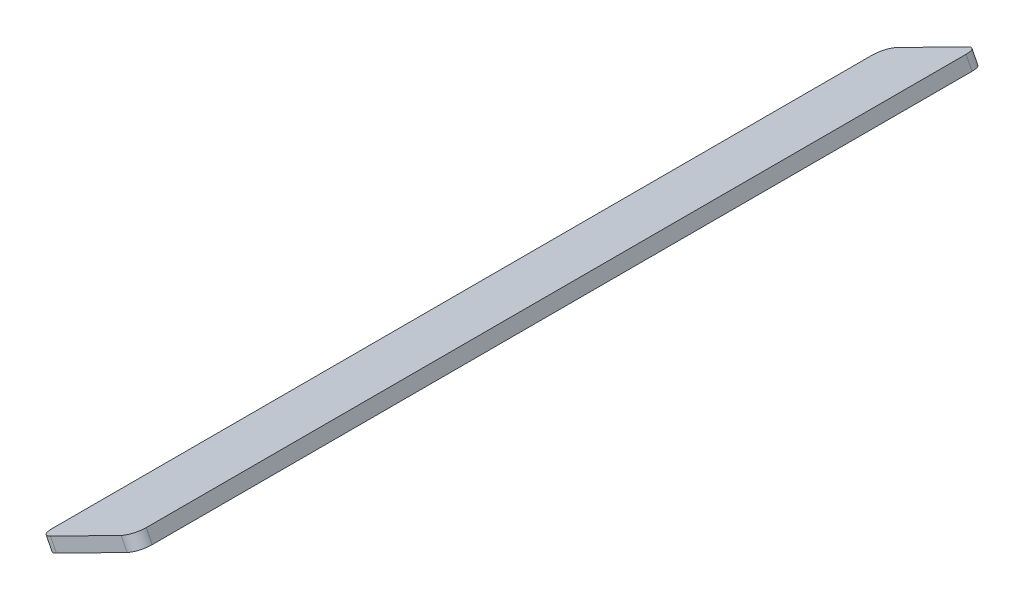
ISO-10303-21;
HEADER;
FILE_DESCRIPTION(('STEP AP214'),'2;1');
FILE_NAME('part.step','',(''),(''),'','','');
FILE_SCHEMA(('AUTOMOTIVE_DESIGN { 1 0 10303 214 1 1 1 1 }'));
ENDSEC;
DATA;
#1=APPLICATION_CONTEXT('core data for automotive mechanical design processes');
#2=APPLICATION_PROTOCOL_DEFINITION('international standard','automotive_design',2000,#1);
#3=PRODUCT_CONTEXT('',#1,'mechanical');
#4=PRODUCT('Part','Part','',(#3));
#5=PRODUCT_RELATED_PRODUCT_CATEGORY('part','',(#4));
#6=PRODUCT_DEFINITION_FORMATION('','',#4);
#7=PRODUCT_DEFINITION_CONTEXT('part definition',#1,'design');
#8=PRODUCT_DEFINITION('design','',#6,#7);
#9=PRODUCT_DEFINITION_SHAPE('','',#8);
#10=(LENGTH_UNIT() NAMED_UNIT(*) SI_UNIT(.MILLI.,.METRE.));
#11=(NAMED_UNIT(*) PLANE_ANGLE_UNIT() SI_UNIT($,.RADIAN.));
#12=(NAMED_UNIT(*) SI_UNIT($,.STERADIAN.) SOLID_ANGLE_UNIT());
#13=UNCERTAINTY_MEASURE_WITH_UNIT(LENGTH_MEASURE(1.E-05),#10,'distance_accuracy_value','');
#14=(GEOMETRIC_REPRESENTATION_CONTEXT(3) GLOBAL_UNCERTAINTY_ASSIGNED_CONTEXT((#13)) GLOBAL_UNIT_ASSIGNED_CONTEXT((#10,
#11,#12)) REPRESENTATION_CONTEXT('',''));
#15=CARTESIAN_POINT('',(0.,0.,0.));
#16=DIRECTION('',(0.,0.,1.));
#17=DIRECTION('',(1.,0.,0.));
#18=AXIS2_PLACEMENT_3D('',#15,#16,#17);
#19=CARTESIAN_POINT('',(449.468318070753,229.015546798506,-203.199999999995));
#20=DIRECTION('',(0.,0.,1.));
#21=DIRECTION('',(0.,-1.,0.));
#22=AXIS2_PLACEMENT_3D('',#19,#20,#21);
#23=PLANE('',#22);
#24=DIRECTION('',(0.891006524188365,0.453990499739552,0.));
#25=VECTOR('',#24,1.);
#26=CARTESIAN_POINT('',(250.436440102014,619.637601430368,-203.199999999999));
#27=LINE('',#26,#25);
#28=CARTESIAN_POINT('',(256.09433153061,622.520441103714,-203.199999999999));
#29=VERTEX_POINT('',#28);
#30=CARTESIAN_POINT('',(290.041680102187,639.817479143791,-203.199999999999));
#31=VERTEX_POINT('',#30);
#32=EDGE_CURVE('E134',#29,#31,#27,.T.);
#33=ORIENTED_EDGE('',*,*,#32,.T.);
#34=DIRECTION('',(0.453990499739552,-0.891006524188366,0.));
#35=VECTOR('',#34,1.);
#36=CARTESIAN_POINT('',(292.924519775532,634.159587715195,-203.199999999999));
#37=LINE('',#36,#35);
#38=CARTESIAN_POINT('',(292.924519775533,634.159587715195,-203.199999999999));
#39=VERTEX_POINT('',#38);
#40=EDGE_CURVE('E124',#31,#39,#37,.T.);
#41=ORIENTED_EDGE('',*,*,#40,.T.);
#42=DIRECTION('',(0.891006524188365,0.453990499739552,0.));
#43=VECTOR('',#42,1.);
#44=CARTESIAN_POINT('',(253.31927977536,613.979710001772,-203.199999999999));
#45=LINE('',#44,#43);
#46=CARTESIAN_POINT('',(258.977171203956,616.862549675118,-203.199999999999));
#47=VERTEX_POINT('',#46);
#48=EDGE_CURVE('E108',#47,#39,#45,.T.);
#49=ORIENTED_EDGE('',*,*,#48,.F.);
#50=DIRECTION('',(0.453990499739552,-0.891006524188366,0.));
#51=VECTOR('',#50,1.);
#52=CARTESIAN_POINT('',(455.126209499349,231.898386471852,-203.199999999995));
#53=LINE('',#52,#51);
#54=EDGE_CURVE('E121',#47,#29,#53,.F.);
#55=ORIENTED_EDGE('',*,*,#54,.T.);
#56=EDGE_LOOP('',(#33,#41,#49,#55));
#57=FACE_BOUND('',#56,.T.);
#58=ADVANCED_FACE('F39',(#57),#23,.F.);
#59=CARTESIAN_POINT('',(253.31927977536,613.979710001772,0.));
#60=DIRECTION('',(0.453990499739552,-0.891006524188365,0.));
#61=DIRECTION('',(0.891006524188365,0.453990499739552,0.));
#62=AXIS2_PLACEMENT_3D('',#59,#60,#61);
#63=PLANE('',#62);
#64=ORIENTED_EDGE('',*,*,#48,.T.);
#65=CARTESIAN_POINT('',(292.924519775533,634.159587715195,-196.849999999999));
#66=DIRECTION('',(0.453990499739552,-0.891006524188365,0.));
#67=DIRECTION('',(0.891006524188365,0.453990499739552,0.));
#68=AXIS2_PLACEMENT_3D('',#65,#66,#67);
#69=CIRCLE('',#68,6.35);
#70=CARTESIAN_POINT('',(298.582411204129,637.042427388541,-196.849999999999));
#71=VERTEX_POINT('',#70);
#72=EDGE_CURVE('E115',#39,#71,#69,.T.);
#73=ORIENTED_EDGE('',*,*,#72,.T.);
#74=DIRECTION('',(0.,0.,-1.));
#75=VECTOR('',#74,1.);
#76=CARTESIAN_POINT('',(298.582411204129,637.042427388541,0.));
#77=LINE('',#76,#75);
#78=CARTESIAN_POINT('',(298.582411204129,637.042427388541,196.85));
#79=VERTEX_POINT('',#78);
#80=EDGE_CURVE('E159',#79,#71,#77,.T.);
#81=ORIENTED_EDGE('',*,*,#80,.F.);
#82=CARTESIAN_POINT('',(292.924519775533,634.159587715195,196.85));
#83=DIRECTION('',(0.453990499739552,-0.891006524188365,0.));
#84=DIRECTION('',(0.891006524188365,0.453990499739552,0.));
#85=AXIS2_PLACEMENT_3D('',#82,#83,#84);
#86=CIRCLE('',#85,6.35);
#87=CARTESIAN_POINT('',(292.924519775533,634.159587715195,203.2));
#88=VERTEX_POINT('',#87);
#89=EDGE_CURVE('E131',#79,#88,#86,.T.);
#90=ORIENTED_EDGE('',*,*,#89,.T.);
#91=DIRECTION('',(0.891006524188365,0.453990499739552,0.));
#92=VECTOR('',#91,1.);
#93=CARTESIAN_POINT('',(253.31927977536,613.979710001772,203.2));
#94=LINE('',#93,#92);
#95=CARTESIAN_POINT('',(258.977171203956,616.862549675118,203.2));
#96=VERTEX_POINT('',#95);
#97=EDGE_CURVE('E125',#96,#88,#94,.T.);
#98=ORIENTED_EDGE('',*,*,#97,.F.);
#99=CARTESIAN_POINT('',(258.977171203956,616.862549675118,196.85));
#100=DIRECTION('',(0.453990499739552,-0.891006524188365,0.));
#101=DIRECTION('',(0.891006524188365,0.453990499739552,0.));
#102=AXIS2_PLACEMENT_3D('',#99,#100,#101);
#103=CIRCLE('',#102,6.35);
#104=CARTESIAN_POINT('',(253.31927977536,613.979710001772,196.85));
#105=VERTEX_POINT('',#104);
#106=EDGE_CURVE('E116',#96,#105,#103,.T.);
#107=ORIENTED_EDGE('',*,*,#106,.T.);
#108=DIRECTION('',(0.,0.,-1.));
#109=VECTOR('',#108,1.);
#110=CARTESIAN_POINT('',(253.31927977536,613.979710001772,0.));
#111=LINE('',#110,#109);
#112=CARTESIAN_POINT('',(253.31927977536,613.979710001772,-196.849999999999));
#113=VERTEX_POINT('',#112);
#114=EDGE_CURVE('E110',#105,#113,#111,.T.);
#115=ORIENTED_EDGE('',*,*,#114,.T.);
#116=CARTESIAN_POINT('',(258.977171203956,616.862549675118,-196.849999999999));
#117=DIRECTION('',(0.453990499739552,-0.891006524188365,0.));
#118=DIRECTION('',(0.891006524188365,0.453990499739552,0.));
#119=AXIS2_PLACEMENT_3D('',#116,#117,#118);
#120=CIRCLE('',#119,6.35);
#121=EDGE_CURVE('E105',#113,#47,#120,.T.);
#122=ORIENTED_EDGE('',*,*,#121,.T.);
#123=EDGE_LOOP('',(#64,#73,#81,#90,#98,#107,#115,#122));
#124=FACE_BOUND('',#123,.T.);
#125=ADVANCED_FACE('F107',(#124),#63,.T.);
#126=CARTESIAN_POINT('',(449.468318070753,229.015546798506,203.199999999996));
#127=DIRECTION('',(0.,0.,1.));
#128=DIRECTION('',(0.,-1.,0.));
#129=AXIS2_PLACEMENT_3D('',#126,#127,#128);
#130=PLANE('',#129);
#131=DIRECTION('',(0.891006524188365,0.453990499739552,0.));
#132=VECTOR('',#131,1.);
#133=CARTESIAN_POINT('',(250.436440102014,619.637601430368,203.2));
#134=LINE('',#133,#132);
#135=CARTESIAN_POINT('',(256.09433153061,622.520441103714,203.2));
#136=VERTEX_POINT('',#135);
#137=CARTESIAN_POINT('',(290.041680102187,639.817479143791,203.2));
#138=VERTEX_POINT('',#137);
#139=EDGE_CURVE('E168',#136,#138,#134,.T.);
#140=ORIENTED_EDGE('',*,*,#139,.F.);
#141=DIRECTION('',(0.453990499739552,-0.891006524188366,0.));
#142=VECTOR('',#141,1.);
#143=CARTESIAN_POINT('',(258.977171203956,616.862549675119,203.2));
#144=LINE('',#143,#142);
#145=EDGE_CURVE('E11',#136,#96,#144,.T.);
#146=ORIENTED_EDGE('',*,*,#145,.T.);
#147=ORIENTED_EDGE('',*,*,#97,.T.);
#148=DIRECTION('',(0.453990499739552,-0.891006524188366,0.));
#149=VECTOR('',#148,1.);
#150=CARTESIAN_POINT('',(489.073558070926,249.195424511929,203.199999999996));
#151=LINE('',#150,#149);
#152=EDGE_CURVE('E47',#88,#138,#151,.F.);
#153=ORIENTED_EDGE('',*,*,#152,.T.);
#154=EDGE_LOOP('',(#140,#146,#147,#153));
#155=FACE_BOUND('',#154,.T.);
#156=ADVANCED_FACE('F181',(#155),#130,.T.);
#157=CARTESIAN_POINT('',(250.436440102014,619.637601430368,0.));
#158=DIRECTION('',(0.453990499739552,-0.891006524188365,0.));
#159=DIRECTION('',(0.891006524188365,0.453990499739552,0.));
#160=AXIS2_PLACEMENT_3D('',#157,#158,#159);
#161=PLANE('',#160);
#162=DIRECTION('',(0.,0.,-1.));
#163=VECTOR('',#162,1.);
#164=CARTESIAN_POINT('',(295.699571530783,642.700318817137,0.));
#165=LINE('',#164,#163);
#166=CARTESIAN_POINT('',(295.699571530783,642.700318817137,196.85));
#167=VERTEX_POINT('',#166);
#168=CARTESIAN_POINT('',(295.699571530783,642.700318817137,-196.849999999999));
#169=VERTEX_POINT('',#168);
#170=EDGE_CURVE('E163',#167,#169,#165,.T.);
#171=ORIENTED_EDGE('',*,*,#170,.T.);
#172=CARTESIAN_POINT('',(290.041680102187,639.817479143791,-196.849999999999));
#173=DIRECTION('',(0.453990499739552,-0.891006524188365,0.));
#174=DIRECTION('',(0.891006524188365,0.453990499739552,0.));
#175=AXIS2_PLACEMENT_3D('',#172,#173,#174);
#176=CIRCLE('',#175,6.35);
#177=EDGE_CURVE('E149',#169,#31,#176,.F.);
#178=ORIENTED_EDGE('',*,*,#177,.T.);
#179=ORIENTED_EDGE('',*,*,#32,.F.);
#180=CARTESIAN_POINT('',(256.09433153061,622.520441103714,-196.849999999999));
#181=DIRECTION('',(0.453990499739552,-0.891006524188365,0.));
#182=DIRECTION('',(0.891006524188365,0.453990499739552,0.));
#183=AXIS2_PLACEMENT_3D('',#180,#181,#182);
#184=CIRCLE('',#183,6.35);
#185=CARTESIAN_POINT('',(250.436440102014,619.637601430368,-196.849999999999));
#186=VERTEX_POINT('',#185);
#187=EDGE_CURVE('E129',#29,#186,#184,.F.);
#188=ORIENTED_EDGE('',*,*,#187,.T.);
#189=DIRECTION('',(0.,0.,-1.));
#190=VECTOR('',#189,1.);
#191=CARTESIAN_POINT('',(250.436440102014,619.637601430368,0.));
#192=LINE('',#191,#190);
#193=CARTESIAN_POINT('',(250.436440102014,619.637601430368,196.85));
#194=VERTEX_POINT('',#193);
#195=EDGE_CURVE('E158',#194,#186,#192,.T.);
#196=ORIENTED_EDGE('',*,*,#195,.F.);
#197=CARTESIAN_POINT('',(256.09433153061,622.520441103714,196.85));
#198=DIRECTION('',(0.453990499739552,-0.891006524188365,0.));
#199=DIRECTION('',(0.891006524188365,0.453990499739552,0.));
#200=AXIS2_PLACEMENT_3D('',#197,#198,#199);
#201=CIRCLE('',#200,6.35);
#202=EDGE_CURVE('E60',#194,#136,#201,.F.);
#203=ORIENTED_EDGE('',*,*,#202,.T.);
#204=ORIENTED_EDGE('',*,*,#139,.T.);
#205=CARTESIAN_POINT('',(290.041680102187,639.817479143791,196.85));
#206=DIRECTION('',(0.453990499739552,-0.891006524188365,0.));
#207=DIRECTION('',(0.891006524188365,0.453990499739552,0.));
#208=AXIS2_PLACEMENT_3D('',#205,#206,#207);
#209=CIRCLE('',#208,6.35);
#210=EDGE_CURVE('E145',#138,#167,#209,.F.);
#211=ORIENTED_EDGE('',*,*,#210,.T.);
#212=EDGE_LOOP('',(#171,#178,#179,#188,#196,#203,#204,#211));
#213=FACE_BOUND('',#212,.T.);
#214=ADVANCED_FACE('F199',(#213),#161,.F.);
#215=CARTESIAN_POINT('',(449.468318070752,229.015546798508,0.));
#216=DIRECTION('',(0.891006524188366,0.453990499739552,0.));
#217=DIRECTION('',(-0.453990499739552,0.891006524188366,0.));
#218=AXIS2_PLACEMENT_3D('',#215,#216,#217);
#219=PLANE('',#218);
#220=ORIENTED_EDGE('',*,*,#195,.T.);
#221=DIRECTION('',(0.453990499739552,-0.891006524188366,0.));
#222=VECTOR('',#221,1.);
#223=CARTESIAN_POINT('',(449.468318070753,229.015546798506,-196.849999999995));
#224=LINE('',#223,#222);
#225=EDGE_CURVE('E153',#186,#113,#224,.T.);
#226=ORIENTED_EDGE('',*,*,#225,.T.);
#227=ORIENTED_EDGE('',*,*,#114,.F.);
#228=DIRECTION('',(0.453990499739552,-0.891006524188366,0.));
#229=VECTOR('',#228,1.);
#230=CARTESIAN_POINT('',(250.436440102014,619.637601430368,196.85));
#231=LINE('',#230,#229);
#232=EDGE_CURVE('E151',#105,#194,#231,.F.);
#233=ORIENTED_EDGE('',*,*,#232,.T.);
#234=EDGE_LOOP('',(#220,#226,#227,#233));
#235=FACE_BOUND('',#234,.T.);
#236=ADVANCED_FACE('F156',(#235),#219,.F.);
#237=CARTESIAN_POINT('',(494.731449499521,252.078264185277,0.));
#238=DIRECTION('',(0.891006524188366,0.453990499739552,0.));
#239=DIRECTION('',(-0.453990499739552,0.891006524188366,0.));
#240=AXIS2_PLACEMENT_3D('',#237,#238,#239);
#241=PLANE('',#240);
#242=ORIENTED_EDGE('',*,*,#80,.T.);
#243=DIRECTION('',(0.453990499739552,-0.891006524188366,0.));
#244=VECTOR('',#243,1.);
#245=CARTESIAN_POINT('',(295.699571530783,642.700318817137,-196.849999999999));
#246=LINE('',#245,#244);
#247=EDGE_CURVE('E143',#71,#169,#246,.F.);
#248=ORIENTED_EDGE('',*,*,#247,.T.);
#249=ORIENTED_EDGE('',*,*,#170,.F.);
#250=DIRECTION('',(0.453990499739552,-0.891006524188366,0.));
#251=VECTOR('',#250,1.);
#252=CARTESIAN_POINT('',(494.731449499522,252.078264185276,196.849999999996));
#253=LINE('',#252,#251);
#254=EDGE_CURVE('E140',#167,#79,#253,.T.);
#255=ORIENTED_EDGE('',*,*,#254,.T.);
#256=EDGE_LOOP('',(#242,#248,#249,#255));
#257=FACE_BOUND('',#256,.T.);
#258=ADVANCED_FACE('F176',(#257),#241,.T.);
#259=CARTESIAN_POINT('',(489.073558070926,249.195424511929,-196.849999999995));
#260=DIRECTION('',(-0.453990499739552,0.891006524188366,0.));
#261=DIRECTION('',(-0.891006524188365,-0.453990499739551,0.));
#262=AXIS2_PLACEMENT_3D('',#259,#260,#261);
#263=CYLINDRICAL_SURFACE('',#262,6.35);
#264=ORIENTED_EDGE('',*,*,#177,.F.);
#265=ORIENTED_EDGE('',*,*,#247,.F.);
#266=ORIENTED_EDGE('',*,*,#72,.F.);
#267=ORIENTED_EDGE('',*,*,#40,.F.);
#268=EDGE_LOOP('',(#264,#265,#266,#267));
#269=FACE_BOUND('',#268,.T.);
#270=ADVANCED_FACE('F172',(#269),#263,.T.);
#271=CARTESIAN_POINT('',(455.126209499349,231.898386471853,-196.849999999995));
#272=DIRECTION('',(0.453990499739552,-0.891006524188366,0.));
#273=DIRECTION('',(0.891006524188365,0.453990499739551,0.));
#274=AXIS2_PLACEMENT_3D('',#271,#272,#273);
#275=CYLINDRICAL_SURFACE('',#274,6.35);
#276=ORIENTED_EDGE('',*,*,#187,.F.);
#277=ORIENTED_EDGE('',*,*,#54,.F.);
#278=ORIENTED_EDGE('',*,*,#121,.F.);
#279=ORIENTED_EDGE('',*,*,#225,.F.);
#280=EDGE_LOOP('',(#276,#277,#278,#279));
#281=FACE_BOUND('',#280,.T.);
#282=ADVANCED_FACE('F128',(#281),#275,.T.);
#283=CARTESIAN_POINT('',(455.126209499349,231.898386471853,196.849999999996));
#284=DIRECTION('',(-0.453990499739552,0.891006524188366,0.));
#285=DIRECTION('',(-0.891006524188365,-0.453990499739551,0.));
#286=AXIS2_PLACEMENT_3D('',#283,#284,#285);
#287=CYLINDRICAL_SURFACE('',#286,6.35);
#288=ORIENTED_EDGE('',*,*,#202,.F.);
#289=ORIENTED_EDGE('',*,*,#232,.F.);
#290=ORIENTED_EDGE('',*,*,#106,.F.);
#291=ORIENTED_EDGE('',*,*,#145,.F.);
#292=EDGE_LOOP('',(#288,#289,#290,#291));
#293=FACE_BOUND('',#292,.T.);
#294=ADVANCED_FACE('F184',(#293),#287,.T.);
#295=CARTESIAN_POINT('',(489.073558070926,249.195424511929,196.849999999996));
#296=DIRECTION('',(0.453990499739552,-0.891006524188366,0.));
#297=DIRECTION('',(0.891006524188365,0.453990499739551,0.));
#298=AXIS2_PLACEMENT_3D('',#295,#296,#297);
#299=CYLINDRICAL_SURFACE('',#298,6.35);
#300=ORIENTED_EDGE('',*,*,#210,.F.);
#301=ORIENTED_EDGE('',*,*,#152,.F.);
#302=ORIENTED_EDGE('',*,*,#89,.F.);
#303=ORIENTED_EDGE('',*,*,#254,.F.);
#304=EDGE_LOOP('',(#300,#301,#302,#303));
#305=FACE_BOUND('',#304,.T.);
#306=ADVANCED_FACE('F41',(#305),#299,.T.);
#307=CLOSED_SHELL('',(#58,#125,#156,#214,#236,#258,#270,#282,#294,#306));
#308=MANIFOLD_SOLID_BREP('B2',#307);
#309=ADVANCED_BREP_SHAPE_REPRESENTATION('',(#18,#308),#14);
#310=SHAPE_DEFINITION_REPRESENTATION(#9,#309);
ENDSEC;
END-ISO-10303-21;
